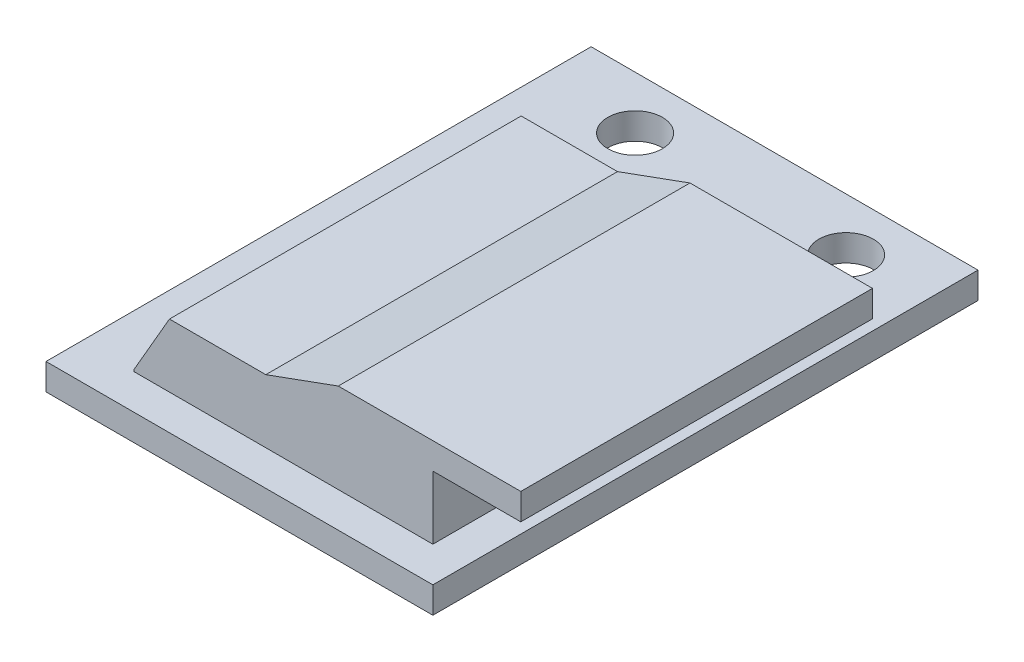
ISO-10303-21;
HEADER;
FILE_DESCRIPTION(('STEP AP214'),'2;1');
FILE_NAME('part.step','',(''),(''),'','','');
FILE_SCHEMA(('AUTOMOTIVE_DESIGN { 1 0 10303 214 1 1 1 1 }'));
ENDSEC;
DATA;
#1=APPLICATION_CONTEXT('core data for automotive mechanical design processes');
#2=APPLICATION_PROTOCOL_DEFINITION('international standard','automotive_design',2000,#1);
#3=PRODUCT_CONTEXT('',#1,'mechanical');
#4=PRODUCT('Part','Part','',(#3));
#5=PRODUCT_RELATED_PRODUCT_CATEGORY('part','',(#4));
#6=PRODUCT_DEFINITION_FORMATION('','',#4);
#7=PRODUCT_DEFINITION_CONTEXT('part definition',#1,'design');
#8=PRODUCT_DEFINITION('design','',#6,#7);
#9=PRODUCT_DEFINITION_SHAPE('','',#8);
#10=(LENGTH_UNIT() NAMED_UNIT(*) SI_UNIT(.MILLI.,.METRE.));
#11=(NAMED_UNIT(*) PLANE_ANGLE_UNIT() SI_UNIT($,.RADIAN.));
#12=(NAMED_UNIT(*) SI_UNIT($,.STERADIAN.) SOLID_ANGLE_UNIT());
#13=UNCERTAINTY_MEASURE_WITH_UNIT(LENGTH_MEASURE(1.E-05),#10,'distance_accuracy_value','');
#14=(GEOMETRIC_REPRESENTATION_CONTEXT(3) GLOBAL_UNCERTAINTY_ASSIGNED_CONTEXT((#13)) GLOBAL_UNIT_ASSIGNED_CONTEXT((#10,
#11,#12)) REPRESENTATION_CONTEXT('',''));
#15=CARTESIAN_POINT('',(0.,0.,0.));
#16=DIRECTION('',(0.,0.,1.));
#17=DIRECTION('',(1.,0.,0.));
#18=AXIS2_PLACEMENT_3D('',#15,#16,#17);
#19=CARTESIAN_POINT('',(-8.5,3.6,10.));
#20=DIRECTION('',(1.,0.,0.));
#21=DIRECTION('',(0.,0.,-1.));
#22=AXIS2_PLACEMENT_3D('',#19,#20,#21);
#23=PLANE('',#22);
#24=DIRECTION('',(0.,-1.,0.));
#25=VECTOR('',#24,1.);
#26=CARTESIAN_POINT('',(-8.5,3.6,10.));
#27=LINE('',#26,#25);
#28=CARTESIAN_POINT('',(-8.5,0.0999999999999898,10.));
#29=VERTEX_POINT('',#28);
#30=CARTESIAN_POINT('',(-8.5,0.,10.));
#31=VERTEX_POINT('',#30);
#32=EDGE_CURVE('E262',#29,#31,#27,.T.);
#33=ORIENTED_EDGE('',*,*,#32,.F.);
#34=DIRECTION('',(0.,0.,-1.));
#35=VECTOR('',#34,1.);
#36=CARTESIAN_POINT('',(-8.5,0.0999999999999898,-10.));
#37=LINE('',#36,#35);
#38=CARTESIAN_POINT('',(-8.5,0.0999999999999898,-10.));
#39=VERTEX_POINT('',#38);
#40=EDGE_CURVE('E50',#29,#39,#37,.T.);
#41=ORIENTED_EDGE('',*,*,#40,.T.);
#42=DIRECTION('',(0.,-1.,0.));
#43=VECTOR('',#42,1.);
#44=CARTESIAN_POINT('',(-8.5,3.6,-10.));
#45=LINE('',#44,#43);
#46=CARTESIAN_POINT('',(-8.5,0.,-10.));
#47=VERTEX_POINT('',#46);
#48=EDGE_CURVE('E237',#39,#47,#45,.T.);
#49=ORIENTED_EDGE('',*,*,#48,.T.);
#50=DIRECTION('',(0.,0.,1.));
#51=VECTOR('',#50,1.);
#52=CARTESIAN_POINT('',(-8.5,0.,10.));
#53=LINE('',#52,#51);
#54=EDGE_CURVE('E224',#47,#31,#53,.T.);
#55=ORIENTED_EDGE('',*,*,#54,.T.);
#56=EDGE_LOOP('',(#33,#41,#49,#55));
#57=FACE_BOUND('',#56,.T.);
#58=ADVANCED_FACE('F41',(#57),#23,.F.);
#59=CARTESIAN_POINT('',(8.5,3.6,10.));
#60=DIRECTION('',(0.,0.,-1.));
#61=DIRECTION('',(-1.,0.,0.));
#62=AXIS2_PLACEMENT_3D('',#59,#60,#61);
#63=PLANE('',#62);
#64=DIRECTION('',(1.,0.,0.));
#65=VECTOR('',#64,1.);
#66=CARTESIAN_POINT('',(8.5,3.6,10.));
#67=LINE('',#66,#65);
#68=CARTESIAN_POINT('',(-6.47927405783632,3.6,10.));
#69=VERTEX_POINT('',#68);
#70=CARTESIAN_POINT('',(-1.00000000000001,3.6,10.));
#71=VERTEX_POINT('',#70);
#72=EDGE_CURVE('E225',#69,#71,#67,.T.);
#73=ORIENTED_EDGE('',*,*,#72,.F.);
#74=DIRECTION('',(-0.499999999999998,-0.86602540378444,0.));
#75=VECTOR('',#74,1.);
#76=CARTESIAN_POINT('',(-6.47927405783632,3.6,10.));
#77=LINE('',#76,#75);
#78=EDGE_CURVE('E64',#69,#29,#77,.T.);
#79=ORIENTED_EDGE('',*,*,#78,.T.);
#80=ORIENTED_EDGE('',*,*,#32,.T.);
#81=DIRECTION('',(1.,0.,0.));
#82=VECTOR('',#81,1.);
#83=CARTESIAN_POINT('',(8.5,0.,10.));
#84=LINE('',#83,#82);
#85=CARTESIAN_POINT('',(8.5,0.,10.));
#86=VERTEX_POINT('',#85);
#87=EDGE_CURVE('E241',#31,#86,#84,.T.);
#88=ORIENTED_EDGE('',*,*,#87,.T.);
#89=DIRECTION('',(0.,-1.,0.));
#90=VECTOR('',#89,1.);
#91=CARTESIAN_POINT('',(8.5,3.6,10.));
#92=LINE('',#91,#90);
#93=CARTESIAN_POINT('',(8.5,3.6,10.));
#94=VERTEX_POINT('',#93);
#95=EDGE_CURVE('E258',#94,#86,#92,.T.);
#96=ORIENTED_EDGE('',*,*,#95,.F.);
#97=DIRECTION('',(1.,0.,0.));
#98=VECTOR('',#97,1.);
#99=CARTESIAN_POINT('',(3.5,3.6,10.));
#100=LINE('',#99,#98);
#101=CARTESIAN_POINT('',(13.5,3.6,10.));
#102=VERTEX_POINT('',#101);
#103=EDGE_CURVE('E157',#94,#102,#100,.T.);
#104=ORIENTED_EDGE('',*,*,#103,.T.);
#105=DIRECTION('',(0.,-1.,0.));
#106=VECTOR('',#105,1.);
#107=CARTESIAN_POINT('',(13.5,5.1,10.));
#108=LINE('',#107,#106);
#109=CARTESIAN_POINT('',(13.5,5.1,10.));
#110=VERTEX_POINT('',#109);
#111=EDGE_CURVE('E164',#110,#102,#108,.T.);
#112=ORIENTED_EDGE('',*,*,#111,.F.);
#113=DIRECTION('',(1.,0.,0.));
#114=VECTOR('',#113,1.);
#115=CARTESIAN_POINT('',(3.5,5.1,10.));
#116=LINE('',#115,#114);
#117=CARTESIAN_POINT('',(3.12121612918184,5.1,10.));
#118=VERTEX_POINT('',#117);
#119=EDGE_CURVE('E148',#118,#110,#116,.T.);
#120=ORIENTED_EDGE('',*,*,#119,.F.);
#121=DIRECTION('',(-0.939692620785906,-0.342020143325675,0.));
#122=VECTOR('',#121,1.);
#123=CARTESIAN_POINT('',(7.3887111048151,6.65324114601112,10.));
#124=LINE('',#123,#122);
#125=EDGE_CURVE('E275',#118,#71,#124,.T.);
#126=ORIENTED_EDGE('',*,*,#125,.T.);
#127=EDGE_LOOP('',(#73,#79,#80,#88,#96,#104,#112,#120,#126));
#128=FACE_BOUND('',#127,.T.);
#129=ADVANCED_FACE('F292',(#128),#63,.F.);
#130=CARTESIAN_POINT('',(8.5,3.6,10.));
#131=DIRECTION('',(-1.,0.,0.));
#132=DIRECTION('',(0.,0.,1.));
#133=AXIS2_PLACEMENT_3D('',#130,#131,#132);
#134=PLANE('',#133);
#135=DIRECTION('',(0.,0.,-1.));
#136=VECTOR('',#135,1.);
#137=CARTESIAN_POINT('',(8.5,0.,10.));
#138=LINE('',#137,#136);
#139=CARTESIAN_POINT('',(8.5,0.,-10.));
#140=VERTEX_POINT('',#139);
#141=EDGE_CURVE('E245',#86,#140,#138,.T.);
#142=ORIENTED_EDGE('',*,*,#141,.T.);
#143=DIRECTION('',(0.,-1.,0.));
#144=VECTOR('',#143,1.);
#145=CARTESIAN_POINT('',(8.5,3.6,-10.));
#146=LINE('',#145,#144);
#147=CARTESIAN_POINT('',(8.5,3.6,-10.));
#148=VERTEX_POINT('',#147);
#149=EDGE_CURVE('E254',#148,#140,#146,.T.);
#150=ORIENTED_EDGE('',*,*,#149,.F.);
#151=DIRECTION('',(0.,0.,-1.));
#152=VECTOR('',#151,1.);
#153=CARTESIAN_POINT('',(8.5,3.6,10.));
#154=LINE('',#153,#152);
#155=EDGE_CURVE('E228',#94,#148,#154,.T.);
#156=ORIENTED_EDGE('',*,*,#155,.F.);
#157=ORIENTED_EDGE('',*,*,#95,.T.);
#158=EDGE_LOOP('',(#142,#150,#156,#157));
#159=FACE_BOUND('',#158,.T.);
#160=ADVANCED_FACE('F307',(#159),#134,.F.);
#161=CARTESIAN_POINT('',(8.5,3.6,-10.));
#162=DIRECTION('',(0.,0.,1.));
#163=DIRECTION('',(1.,0.,0.));
#164=AXIS2_PLACEMENT_3D('',#161,#162,#163);
#165=PLANE('',#164);
#166=ORIENTED_EDGE('',*,*,#48,.F.);
#167=DIRECTION('',(0.499999999999998,0.86602540378444,0.));
#168=VECTOR('',#167,1.);
#169=CARTESIAN_POINT('',(-6.47927405783632,3.6,-10.));
#170=LINE('',#169,#168);
#171=CARTESIAN_POINT('',(-6.47927405783632,3.6,-10.));
#172=VERTEX_POINT('',#171);
#173=EDGE_CURVE('E11',#39,#172,#170,.T.);
#174=ORIENTED_EDGE('',*,*,#173,.T.);
#175=DIRECTION('',(-1.,0.,0.));
#176=VECTOR('',#175,1.);
#177=CARTESIAN_POINT('',(8.5,3.6,-10.));
#178=LINE('',#177,#176);
#179=CARTESIAN_POINT('',(-1.00000000000001,3.6,-10.));
#180=VERTEX_POINT('',#179);
#181=EDGE_CURVE('E233',#180,#172,#178,.T.);
#182=ORIENTED_EDGE('',*,*,#181,.F.);
#183=DIRECTION('',(0.939692620785906,0.342020143325675,0.));
#184=VECTOR('',#183,1.);
#185=CARTESIAN_POINT('',(7.3887111048151,6.65324114601112,-10.));
#186=LINE('',#185,#184);
#187=CARTESIAN_POINT('',(3.12121612918184,5.1,-10.));
#188=VERTEX_POINT('',#187);
#189=EDGE_CURVE('E143',#180,#188,#186,.T.);
#190=ORIENTED_EDGE('',*,*,#189,.T.);
#191=DIRECTION('',(-1.,0.,0.));
#192=VECTOR('',#191,1.);
#193=CARTESIAN_POINT('',(3.5,5.1,-10.));
#194=LINE('',#193,#192);
#195=CARTESIAN_POINT('',(13.5,5.1,-10.));
#196=VERTEX_POINT('',#195);
#197=EDGE_CURVE('E135',#196,#188,#194,.T.);
#198=ORIENTED_EDGE('',*,*,#197,.F.);
#199=DIRECTION('',(0.,-1.,0.));
#200=VECTOR('',#199,1.);
#201=CARTESIAN_POINT('',(13.5,5.1,-10.));
#202=LINE('',#201,#200);
#203=CARTESIAN_POINT('',(13.5,3.6,-10.));
#204=VERTEX_POINT('',#203);
#205=EDGE_CURVE('E140',#196,#204,#202,.T.);
#206=ORIENTED_EDGE('',*,*,#205,.T.);
#207=DIRECTION('',(-1.,0.,0.));
#208=VECTOR('',#207,1.);
#209=CARTESIAN_POINT('',(3.5,3.6,-10.));
#210=LINE('',#209,#208);
#211=EDGE_CURVE('E468',#204,#148,#210,.T.);
#212=ORIENTED_EDGE('',*,*,#211,.T.);
#213=ORIENTED_EDGE('',*,*,#149,.T.);
#214=DIRECTION('',(-1.,0.,0.));
#215=VECTOR('',#214,1.);
#216=CARTESIAN_POINT('',(8.5,0.,-10.));
#217=LINE('',#216,#215);
#218=EDGE_CURVE('E229',#140,#47,#217,.T.);
#219=ORIENTED_EDGE('',*,*,#218,.T.);
#220=EDGE_LOOP('',(#166,#174,#182,#190,#198,#206,#212,#213,#219));
#221=FACE_BOUND('',#220,.T.);
#222=ADVANCED_FACE('F137',(#221),#165,.F.);
#223=CARTESIAN_POINT('',(0.,3.6,0.));
#224=DIRECTION('',(0.,1.,0.));
#225=DIRECTION('',(0.,0.,1.));
#226=AXIS2_PLACEMENT_3D('',#223,#224,#225);
#227=PLANE('',#226);
#228=ORIENTED_EDGE('',*,*,#181,.T.);
#229=DIRECTION('',(0.,0.,1.));
#230=VECTOR('',#229,1.);
#231=CARTESIAN_POINT('',(-6.47927405783632,3.6,10.));
#232=LINE('',#231,#230);
#233=EDGE_CURVE('E281',#172,#69,#232,.T.);
#234=ORIENTED_EDGE('',*,*,#233,.T.);
#235=ORIENTED_EDGE('',*,*,#72,.T.);
#236=DIRECTION('',(0.,0.,-1.));
#237=VECTOR('',#236,1.);
#238=CARTESIAN_POINT('',(-1.00000000000001,3.6,0.));
#239=LINE('',#238,#237);
#240=EDGE_CURVE('E265',#71,#180,#239,.T.);
#241=ORIENTED_EDGE('',*,*,#240,.T.);
#242=EDGE_LOOP('',(#228,#234,#235,#241));
#243=FACE_BOUND('',#242,.T.);
#244=ADVANCED_FACE('F289',(#243),#227,.T.);
#245=CARTESIAN_POINT('',(0.,0.,0.));
#246=DIRECTION('',(0.,1.,0.));
#247=DIRECTION('',(0.,0.,1.));
#248=AXIS2_PLACEMENT_3D('',#245,#246,#247);
#249=PLANE('',#248);
#250=CARTESIAN_POINT('',(-6.,0.,-16.));
#251=DIRECTION('',(0.,1.,0.));
#252=DIRECTION('',(0.,0.,1.));
#253=AXIS2_PLACEMENT_3D('',#250,#251,#252);
#254=CIRCLE('',#253,1.55);
#255=CARTESIAN_POINT('',(-6.,0.,-14.45));
#256=VERTEX_POINT('',#255);
#257=EDGE_CURVE('E169',#256,#256,#254,.T.);
#258=ORIENTED_EDGE('',*,*,#257,.F.);
#259=EDGE_LOOP('',(#258));
#260=FACE_BOUND('',#259,.T.);
#261=CARTESIAN_POINT('',(6.,0.,-16.));
#262=DIRECTION('',(0.,1.,0.));
#263=DIRECTION('',(0.,0.,1.));
#264=AXIS2_PLACEMENT_3D('',#261,#262,#263);
#265=CIRCLE('',#264,1.55);
#266=CARTESIAN_POINT('',(6.,0.,-14.45));
#267=VERTEX_POINT('',#266);
#268=EDGE_CURVE('E181',#267,#267,#265,.T.);
#269=ORIENTED_EDGE('',*,*,#268,.F.);
#270=EDGE_LOOP('',(#269));
#271=FACE_BOUND('',#270,.T.);
#272=DIRECTION('',(0.,0.,-1.));
#273=VECTOR('',#272,1.);
#274=CARTESIAN_POINT('',(-11.5,0.,-19.));
#275=LINE('',#274,#273);
#276=CARTESIAN_POINT('',(-11.5,0.,12.));
#277=VERTEX_POINT('',#276);
#278=CARTESIAN_POINT('',(-11.5,0.,-19.));
#279=VERTEX_POINT('',#278);
#280=EDGE_CURVE('E197',#277,#279,#275,.T.);
#281=ORIENTED_EDGE('',*,*,#280,.F.);
#282=DIRECTION('',(-1.,0.,0.));
#283=VECTOR('',#282,1.);
#284=CARTESIAN_POINT('',(-11.5,0.,12.));
#285=LINE('',#284,#283);
#286=CARTESIAN_POINT('',(10.5,0.,12.));
#287=VERTEX_POINT('',#286);
#288=EDGE_CURVE('E187',#287,#277,#285,.T.);
#289=ORIENTED_EDGE('',*,*,#288,.F.);
#290=DIRECTION('',(0.,0.,1.));
#291=VECTOR('',#290,1.);
#292=CARTESIAN_POINT('',(10.5,0.,-19.));
#293=LINE('',#292,#291);
#294=CARTESIAN_POINT('',(10.5,0.,-19.));
#295=VERTEX_POINT('',#294);
#296=EDGE_CURVE('E204',#295,#287,#293,.T.);
#297=ORIENTED_EDGE('',*,*,#296,.F.);
#298=DIRECTION('',(1.,0.,0.));
#299=VECTOR('',#298,1.);
#300=CARTESIAN_POINT('',(-11.5,0.,-19.));
#301=LINE('',#300,#299);
#302=EDGE_CURVE('E201',#279,#295,#301,.T.);
#303=ORIENTED_EDGE('',*,*,#302,.F.);
#304=EDGE_LOOP('',(#281,#289,#297,#303));
#305=FACE_BOUND('',#304,.T.);
#306=ORIENTED_EDGE('',*,*,#54,.F.);
#307=ORIENTED_EDGE('',*,*,#218,.F.);
#308=ORIENTED_EDGE('',*,*,#141,.F.);
#309=ORIENTED_EDGE('',*,*,#87,.F.);
#310=EDGE_LOOP('',(#306,#307,#308,#309));
#311=FACE_BOUND('',#310,.T.);
#312=ADVANCED_FACE('F317',(#260,#271,#305,#311),#249,.T.);
#313=CARTESIAN_POINT('',(-11.5,-1.5,-19.));
#314=DIRECTION('',(1.,0.,0.));
#315=DIRECTION('',(0.,0.,-1.));
#316=AXIS2_PLACEMENT_3D('',#313,#314,#315);
#317=PLANE('',#316);
#318=ORIENTED_EDGE('',*,*,#280,.T.);
#319=DIRECTION('',(0.,1.,0.));
#320=VECTOR('',#319,1.);
#321=CARTESIAN_POINT('',(-11.5,-1.5,-19.));
#322=LINE('',#321,#320);
#323=CARTESIAN_POINT('',(-11.5,-1.5,-19.));
#324=VERTEX_POINT('',#323);
#325=EDGE_CURVE('E220',#324,#279,#322,.T.);
#326=ORIENTED_EDGE('',*,*,#325,.F.);
#327=DIRECTION('',(0.,0.,-1.));
#328=VECTOR('',#327,1.);
#329=CARTESIAN_POINT('',(-11.5,-1.5,-19.));
#330=LINE('',#329,#328);
#331=CARTESIAN_POINT('',(-11.5,-1.5,12.));
#332=VERTEX_POINT('',#331);
#333=EDGE_CURVE('E182',#332,#324,#330,.T.);
#334=ORIENTED_EDGE('',*,*,#333,.F.);
#335=DIRECTION('',(0.,1.,0.));
#336=VECTOR('',#335,1.);
#337=CARTESIAN_POINT('',(-11.5,-1.5,12.));
#338=LINE('',#337,#336);
#339=EDGE_CURVE('E196',#332,#277,#338,.T.);
#340=ORIENTED_EDGE('',*,*,#339,.T.);
#341=EDGE_LOOP('',(#318,#326,#334,#340));
#342=FACE_BOUND('',#341,.T.);
#343=ADVANCED_FACE('F318',(#342),#317,.F.);
#344=CARTESIAN_POINT('',(-11.5,-1.5,-19.));
#345=DIRECTION('',(0.,0.,1.));
#346=DIRECTION('',(1.,0.,0.));
#347=AXIS2_PLACEMENT_3D('',#344,#345,#346);
#348=PLANE('',#347);
#349=ORIENTED_EDGE('',*,*,#302,.T.);
#350=DIRECTION('',(0.,1.,0.));
#351=VECTOR('',#350,1.);
#352=CARTESIAN_POINT('',(10.5,-1.5,-19.));
#353=LINE('',#352,#351);
#354=CARTESIAN_POINT('',(10.5,-1.5,-19.));
#355=VERTEX_POINT('',#354);
#356=EDGE_CURVE('E216',#355,#295,#353,.T.);
#357=ORIENTED_EDGE('',*,*,#356,.F.);
#358=DIRECTION('',(1.,0.,0.));
#359=VECTOR('',#358,1.);
#360=CARTESIAN_POINT('',(-11.5,-1.5,-19.));
#361=LINE('',#360,#359);
#362=EDGE_CURVE('E186',#324,#355,#361,.T.);
#363=ORIENTED_EDGE('',*,*,#362,.F.);
#364=ORIENTED_EDGE('',*,*,#325,.T.);
#365=EDGE_LOOP('',(#349,#357,#363,#364));
#366=FACE_BOUND('',#365,.T.);
#367=ADVANCED_FACE('F321',(#366),#348,.F.);
#368=CARTESIAN_POINT('',(10.5,-1.5,-19.));
#369=DIRECTION('',(-1.,0.,0.));
#370=DIRECTION('',(0.,0.,1.));
#371=AXIS2_PLACEMENT_3D('',#368,#369,#370);
#372=PLANE('',#371);
#373=ORIENTED_EDGE('',*,*,#296,.T.);
#374=DIRECTION('',(0.,1.,0.));
#375=VECTOR('',#374,1.);
#376=CARTESIAN_POINT('',(10.5,-1.5,12.));
#377=LINE('',#376,#375);
#378=CARTESIAN_POINT('',(10.5,-1.5,12.));
#379=VERTEX_POINT('',#378);
#380=EDGE_CURVE('E212',#379,#287,#377,.T.);
#381=ORIENTED_EDGE('',*,*,#380,.F.);
#382=DIRECTION('',(0.,0.,1.));
#383=VECTOR('',#382,1.);
#384=CARTESIAN_POINT('',(10.5,-1.5,-19.));
#385=LINE('',#384,#383);
#386=EDGE_CURVE('E190',#355,#379,#385,.T.);
#387=ORIENTED_EDGE('',*,*,#386,.F.);
#388=ORIENTED_EDGE('',*,*,#356,.T.);
#389=EDGE_LOOP('',(#373,#381,#387,#388));
#390=FACE_BOUND('',#389,.T.);
#391=ADVANCED_FACE('F325',(#390),#372,.F.);
#392=CARTESIAN_POINT('',(-11.5,-1.5,12.));
#393=DIRECTION('',(0.,0.,-1.));
#394=DIRECTION('',(-1.,0.,0.));
#395=AXIS2_PLACEMENT_3D('',#392,#393,#394);
#396=PLANE('',#395);
#397=ORIENTED_EDGE('',*,*,#288,.T.);
#398=ORIENTED_EDGE('',*,*,#339,.F.);
#399=DIRECTION('',(-1.,0.,0.));
#400=VECTOR('',#399,1.);
#401=CARTESIAN_POINT('',(-11.5,-1.5,12.));
#402=LINE('',#401,#400);
#403=EDGE_CURVE('E193',#379,#332,#402,.T.);
#404=ORIENTED_EDGE('',*,*,#403,.F.);
#405=ORIENTED_EDGE('',*,*,#380,.T.);
#406=EDGE_LOOP('',(#397,#398,#404,#405));
#407=FACE_BOUND('',#406,.T.);
#408=ADVANCED_FACE('F329',(#407),#396,.F.);
#409=CARTESIAN_POINT('',(0.,-1.5,0.));
#410=DIRECTION('',(0.,1.,0.));
#411=DIRECTION('',(0.,0.,1.));
#412=AXIS2_PLACEMENT_3D('',#409,#410,#411);
#413=PLANE('',#412);
#414=CARTESIAN_POINT('',(-6.,-1.5,-16.));
#415=DIRECTION('',(0.,-1.,0.));
#416=DIRECTION('',(0.,0.,-1.));
#417=AXIS2_PLACEMENT_3D('',#414,#415,#416);
#418=CIRCLE('',#417,1.55);
#419=CARTESIAN_POINT('',(-6.,-1.5,-17.55));
#420=VERTEX_POINT('',#419);
#421=EDGE_CURVE('E163',#420,#420,#418,.T.);
#422=ORIENTED_EDGE('',*,*,#421,.F.);
#423=EDGE_LOOP('',(#422));
#424=FACE_BOUND('',#423,.T.);
#425=CARTESIAN_POINT('',(6.,-1.5,-16.));
#426=DIRECTION('',(0.,-1.,0.));
#427=DIRECTION('',(0.,0.,-1.));
#428=AXIS2_PLACEMENT_3D('',#425,#426,#427);
#429=CIRCLE('',#428,1.55);
#430=CARTESIAN_POINT('',(6.,-1.5,-17.55));
#431=VERTEX_POINT('',#430);
#432=EDGE_CURVE('E177',#431,#431,#429,.T.);
#433=ORIENTED_EDGE('',*,*,#432,.F.);
#434=EDGE_LOOP('',(#433));
#435=FACE_BOUND('',#434,.T.);
#436=ORIENTED_EDGE('',*,*,#333,.T.);
#437=ORIENTED_EDGE('',*,*,#362,.T.);
#438=ORIENTED_EDGE('',*,*,#386,.T.);
#439=ORIENTED_EDGE('',*,*,#403,.T.);
#440=EDGE_LOOP('',(#436,#437,#438,#439));
#441=FACE_BOUND('',#440,.T.);
#442=ADVANCED_FACE('F333',(#424,#435,#441),#413,.F.);
#443=CARTESIAN_POINT('',(6.,-1.5,-16.));
#444=DIRECTION('',(0.,-1.,0.));
#445=DIRECTION('',(0.,0.,-1.));
#446=AXIS2_PLACEMENT_3D('',#443,#444,#445);
#447=CYLINDRICAL_SURFACE('',#446,1.55);
#448=ORIENTED_EDGE('',*,*,#268,.T.);
#449=EDGE_LOOP('',(#448));
#450=FACE_BOUND('',#449,.T.);
#451=ORIENTED_EDGE('',*,*,#432,.T.);
#452=EDGE_LOOP('',(#451));
#453=FACE_BOUND('',#452,.T.);
#454=ADVANCED_FACE('F340',(#450,#453),#447,.F.);
#455=CARTESIAN_POINT('',(-6.,-1.5,-16.));
#456=DIRECTION('',(0.,-1.,0.));
#457=DIRECTION('',(0.,0.,-1.));
#458=AXIS2_PLACEMENT_3D('',#455,#456,#457);
#459=CYLINDRICAL_SURFACE('',#458,1.55);
#460=ORIENTED_EDGE('',*,*,#257,.T.);
#461=EDGE_LOOP('',(#460));
#462=FACE_BOUND('',#461,.T.);
#463=ORIENTED_EDGE('',*,*,#421,.T.);
#464=EDGE_LOOP('',(#463));
#465=FACE_BOUND('',#464,.T.);
#466=ADVANCED_FACE('F344',(#462,#465),#459,.F.);
#467=CARTESIAN_POINT('',(13.5,5.1,10.));
#468=DIRECTION('',(-1.,0.,0.));
#469=DIRECTION('',(0.,0.,1.));
#470=AXIS2_PLACEMENT_3D('',#467,#468,#469);
#471=PLANE('',#470);
#472=DIRECTION('',(0.,0.,-1.));
#473=VECTOR('',#472,1.);
#474=CARTESIAN_POINT('',(13.5,3.6,10.));
#475=LINE('',#474,#473);
#476=EDGE_CURVE('E161',#102,#204,#475,.T.);
#477=ORIENTED_EDGE('',*,*,#476,.T.);
#478=ORIENTED_EDGE('',*,*,#205,.F.);
#479=DIRECTION('',(0.,0.,-1.));
#480=VECTOR('',#479,1.);
#481=CARTESIAN_POINT('',(13.5,5.1,10.));
#482=LINE('',#481,#480);
#483=EDGE_CURVE('E149',#110,#196,#482,.T.);
#484=ORIENTED_EDGE('',*,*,#483,.F.);
#485=ORIENTED_EDGE('',*,*,#111,.T.);
#486=EDGE_LOOP('',(#477,#478,#484,#485));
#487=FACE_BOUND('',#486,.T.);
#488=ADVANCED_FACE('F159',(#487),#471,.F.);
#489=CARTESIAN_POINT('',(0.,5.1,0.));
#490=DIRECTION('',(0.,-1.,0.));
#491=DIRECTION('',(0.,0.,-1.));
#492=AXIS2_PLACEMENT_3D('',#489,#490,#491);
#493=PLANE('',#492);
#494=ORIENTED_EDGE('',*,*,#483,.T.);
#495=ORIENTED_EDGE('',*,*,#197,.T.);
#496=DIRECTION('',(0.,0.,1.));
#497=VECTOR('',#496,1.);
#498=CARTESIAN_POINT('',(3.12121612918184,5.1,0.));
#499=LINE('',#498,#497);
#500=EDGE_CURVE('E272',#188,#118,#499,.T.);
#501=ORIENTED_EDGE('',*,*,#500,.T.);
#502=ORIENTED_EDGE('',*,*,#119,.T.);
#503=EDGE_LOOP('',(#494,#495,#501,#502));
#504=FACE_BOUND('',#503,.T.);
#505=ADVANCED_FACE('F152',(#504),#493,.F.);
#506=CARTESIAN_POINT('',(0.,3.6,0.));
#507=DIRECTION('',(0.,-1.,0.));
#508=DIRECTION('',(0.,0.,-1.));
#509=AXIS2_PLACEMENT_3D('',#506,#507,#508);
#510=PLANE('',#509);
#511=ORIENTED_EDGE('',*,*,#103,.F.);
#512=ORIENTED_EDGE('',*,*,#155,.T.);
#513=ORIENTED_EDGE('',*,*,#211,.F.);
#514=ORIENTED_EDGE('',*,*,#476,.F.);
#515=EDGE_LOOP('',(#511,#512,#513,#514));
#516=FACE_BOUND('',#515,.T.);
#517=ADVANCED_FACE('F301',(#516),#510,.T.);
#518=CARTESIAN_POINT('',(3.5,5.23786605419795,10.));
#519=DIRECTION('',(0.342020143325675,-0.939692620785906,0.));
#520=DIRECTION('',(0.,0.,1.));
#521=AXIS2_PLACEMENT_3D('',#518,#519,#520);
#522=PLANE('',#521);
#523=ORIENTED_EDGE('',*,*,#189,.F.);
#524=ORIENTED_EDGE('',*,*,#240,.F.);
#525=ORIENTED_EDGE('',*,*,#125,.F.);
#526=ORIENTED_EDGE('',*,*,#500,.F.);
#527=EDGE_LOOP('',(#523,#524,#525,#526));
#528=FACE_BOUND('',#527,.T.);
#529=ADVANCED_FACE('F296',(#528),#522,.F.);
#530=CARTESIAN_POINT('',(-6.47927405783632,3.6,0.));
#531=DIRECTION('',(-0.86602540378444,0.499999999999998,0.));
#532=DIRECTION('',(0.,0.,-1.));
#533=AXIS2_PLACEMENT_3D('',#530,#531,#532);
#534=PLANE('',#533);
#535=ORIENTED_EDGE('',*,*,#173,.F.);
#536=ORIENTED_EDGE('',*,*,#40,.F.);
#537=ORIENTED_EDGE('',*,*,#78,.F.);
#538=ORIENTED_EDGE('',*,*,#233,.F.);
#539=EDGE_LOOP('',(#535,#536,#537,#538));
#540=FACE_BOUND('',#539,.T.);
#541=ADVANCED_FACE('F43',(#540),#534,.T.);
#542=CLOSED_SHELL('',(#58,#129,#160,#222,#244,#312,#343,#367,#391,#408,#442,#454,#466,#488,#505,
#517,#529,#541));
#543=MANIFOLD_SOLID_BREP('B2',#542);
#544=ADVANCED_BREP_SHAPE_REPRESENTATION('',(#18,#543),#14);
#545=SHAPE_DEFINITION_REPRESENTATION(#9,#544);
ENDSEC;
END-ISO-10303-21;
